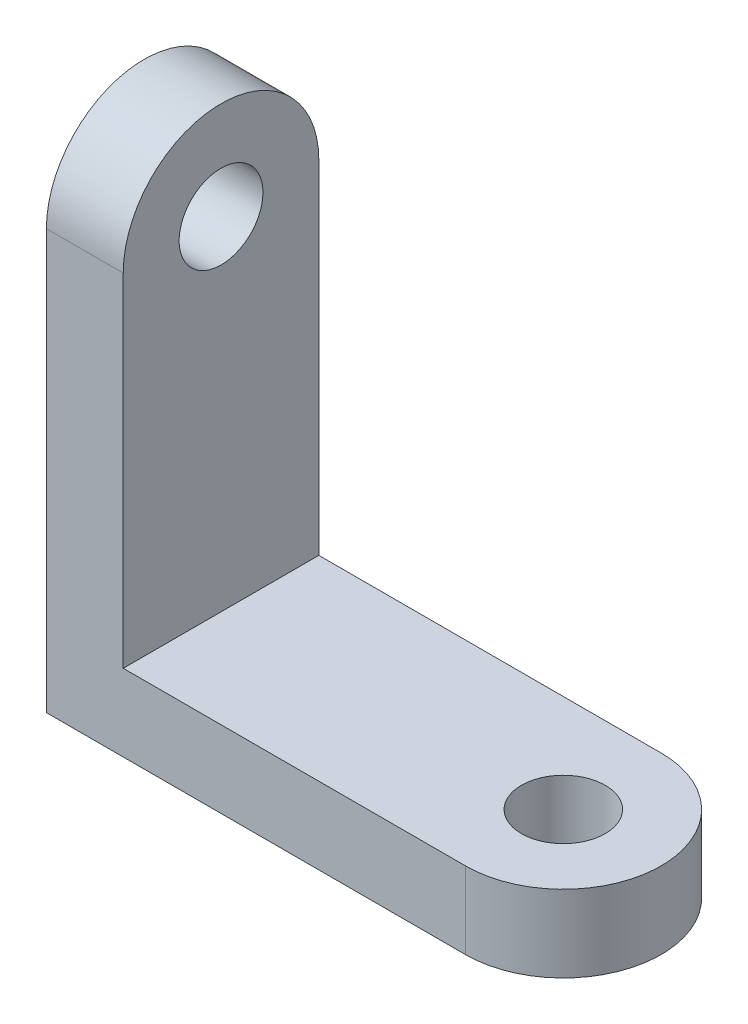
ISO-10303-21;
HEADER;
FILE_DESCRIPTION(('STEP AP214'),'2;1');
FILE_NAME('part.step','',(''),(''),'','','');
FILE_SCHEMA(('AUTOMOTIVE_DESIGN { 1 0 10303 214 1 1 1 1 }'));
ENDSEC;
DATA;
#1=APPLICATION_CONTEXT('core data for automotive mechanical design processes');
#2=APPLICATION_PROTOCOL_DEFINITION('international standard','automotive_design',2000,#1);
#3=PRODUCT_CONTEXT('',#1,'mechanical');
#4=PRODUCT('Part','Part','',(#3));
#5=PRODUCT_RELATED_PRODUCT_CATEGORY('part','',(#4));
#6=PRODUCT_DEFINITION_FORMATION('','',#4);
#7=PRODUCT_DEFINITION_CONTEXT('part definition',#1,'design');
#8=PRODUCT_DEFINITION('design','',#6,#7);
#9=PRODUCT_DEFINITION_SHAPE('','',#8);
#10=(LENGTH_UNIT() NAMED_UNIT(*) SI_UNIT(.MILLI.,.METRE.));
#11=(NAMED_UNIT(*) PLANE_ANGLE_UNIT() SI_UNIT($,.RADIAN.));
#12=(NAMED_UNIT(*) SI_UNIT($,.STERADIAN.) SOLID_ANGLE_UNIT());
#13=UNCERTAINTY_MEASURE_WITH_UNIT(LENGTH_MEASURE(1.E-05),#10,'distance_accuracy_value','');
#14=(GEOMETRIC_REPRESENTATION_CONTEXT(3) GLOBAL_UNCERTAINTY_ASSIGNED_CONTEXT((#13)) GLOBAL_UNIT_ASSIGNED_CONTEXT((#10,
#11,#12)) REPRESENTATION_CONTEXT('',''));
#15=CARTESIAN_POINT('',(0.,0.,0.));
#16=DIRECTION('',(0.,0.,1.));
#17=DIRECTION('',(1.,0.,0.));
#18=AXIS2_PLACEMENT_3D('',#15,#16,#17);
#19=CARTESIAN_POINT('',(-7.5,2.75,-3.5));
#20=DIRECTION('',(1.,0.,0.));
#21=DIRECTION('',(0.,0.,-1.));
#22=AXIS2_PLACEMENT_3D('',#19,#20,#21);
#23=PLANE('',#22);
#24=CARTESIAN_POINT('',(-7.5,15.,0.));
#25=DIRECTION('',(1.,0.,0.));
#26=DIRECTION('',(0.,0.,-1.));
#27=AXIS2_PLACEMENT_3D('',#24,#25,#26);
#28=CIRCLE('',#27,1.5);
#29=CARTESIAN_POINT('',(-7.5,15.,-1.5));
#30=VERTEX_POINT('',#29);
#31=EDGE_CURVE('E114',#30,#30,#28,.T.);
#32=ORIENTED_EDGE('',*,*,#31,.T.);
#33=EDGE_LOOP('',(#32));
#34=FACE_BOUND('',#33,.T.);
#35=DIRECTION('',(0.,0.,1.));
#36=VECTOR('',#35,1.);
#37=CARTESIAN_POINT('',(-7.5,0.,-3.5));
#38=LINE('',#37,#36);
#39=CARTESIAN_POINT('',(-7.5,0.,-3.5));
#40=VERTEX_POINT('',#39);
#41=CARTESIAN_POINT('',(-7.5,0.,3.5));
#42=VERTEX_POINT('',#41);
#43=EDGE_CURVE('E121',#40,#42,#38,.T.);
#44=ORIENTED_EDGE('',*,*,#43,.T.);
#45=DIRECTION('',(0.,-1.,0.));
#46=VECTOR('',#45,1.);
#47=CARTESIAN_POINT('',(-7.5,2.75,3.5));
#48=LINE('',#47,#46);
#49=CARTESIAN_POINT('',(-7.5,15.,3.5));
#50=VERTEX_POINT('',#49);
#51=EDGE_CURVE('E11',#50,#42,#48,.T.);
#52=ORIENTED_EDGE('',*,*,#51,.F.);
#53=CARTESIAN_POINT('',(-7.5,15.,0.));
#54=DIRECTION('',(-1.,0.,0.));
#55=DIRECTION('',(0.,0.,-1.));
#56=AXIS2_PLACEMENT_3D('',#53,#54,#55);
#57=CIRCLE('',#56,3.5);
#58=CARTESIAN_POINT('',(-7.5,15.,-3.5));
#59=VERTEX_POINT('',#58);
#60=EDGE_CURVE('E104',#50,#59,#57,.T.);
#61=ORIENTED_EDGE('',*,*,#60,.T.);
#62=DIRECTION('',(0.,-1.,0.));
#63=VECTOR('',#62,1.);
#64=CARTESIAN_POINT('',(-7.5,2.75,-3.5));
#65=LINE('',#64,#63);
#66=EDGE_CURVE('E129',#59,#40,#65,.T.);
#67=ORIENTED_EDGE('',*,*,#66,.T.);
#68=EDGE_LOOP('',(#44,#52,#61,#67));
#69=FACE_BOUND('',#68,.T.);
#70=ADVANCED_FACE('F37',(#34,#69),#23,.F.);
#71=CARTESIAN_POINT('',(-7.5,2.75,3.5));
#72=DIRECTION('',(0.,0.,-1.));
#73=DIRECTION('',(-1.,0.,0.));
#74=AXIS2_PLACEMENT_3D('',#71,#72,#73);
#75=PLANE('',#74);
#76=DIRECTION('',(1.,0.,0.));
#77=VECTOR('',#76,1.);
#78=CARTESIAN_POINT('',(-7.5,2.75,3.5));
#79=LINE('',#78,#77);
#80=CARTESIAN_POINT('',(-4.75,2.75,3.5));
#81=VERTEX_POINT('',#80);
#82=CARTESIAN_POINT('',(7.5,2.75,3.5));
#83=VERTEX_POINT('',#82);
#84=EDGE_CURVE('E93',#81,#83,#79,.T.);
#85=ORIENTED_EDGE('',*,*,#84,.F.);
#86=DIRECTION('',(0.,1.,0.));
#87=VECTOR('',#86,1.);
#88=CARTESIAN_POINT('',(-4.75,0.,3.5));
#89=LINE('',#88,#87);
#90=CARTESIAN_POINT('',(-4.75,15.,3.5));
#91=VERTEX_POINT('',#90);
#92=EDGE_CURVE('E87',#81,#91,#89,.T.);
#93=ORIENTED_EDGE('',*,*,#92,.T.);
#94=DIRECTION('',(-1.,0.,0.));
#95=VECTOR('',#94,1.);
#96=CARTESIAN_POINT('',(-4.75,15.,3.5));
#97=LINE('',#96,#95);
#98=EDGE_CURVE('E90',#91,#50,#97,.T.);
#99=ORIENTED_EDGE('',*,*,#98,.T.);
#100=ORIENTED_EDGE('',*,*,#51,.T.);
#101=DIRECTION('',(1.,0.,0.));
#102=VECTOR('',#101,1.);
#103=CARTESIAN_POINT('',(-7.5,0.,3.5));
#104=LINE('',#103,#102);
#105=CARTESIAN_POINT('',(7.5,0.,3.5));
#106=VERTEX_POINT('',#105);
#107=EDGE_CURVE('E132',#42,#106,#104,.T.);
#108=ORIENTED_EDGE('',*,*,#107,.T.);
#109=DIRECTION('',(0.,-1.,0.));
#110=VECTOR('',#109,1.);
#111=CARTESIAN_POINT('',(7.5,2.75,3.5));
#112=LINE('',#111,#110);
#113=EDGE_CURVE('E44',#83,#106,#112,.T.);
#114=ORIENTED_EDGE('',*,*,#113,.F.);
#115=EDGE_LOOP('',(#85,#93,#99,#100,#108,#114));
#116=FACE_BOUND('',#115,.T.);
#117=ADVANCED_FACE('F89',(#116),#75,.F.);
#118=CARTESIAN_POINT('',(7.5,2.75,0.));
#119=DIRECTION('',(0.,-1.,0.));
#120=DIRECTION('',(0.,0.,-1.));
#121=AXIS2_PLACEMENT_3D('',#118,#119,#120);
#122=CYLINDRICAL_SURFACE('',#121,3.5);
#123=CARTESIAN_POINT('',(7.5,0.,0.));
#124=DIRECTION('',(0.,1.,0.));
#125=DIRECTION('',(0.,0.,-1.));
#126=AXIS2_PLACEMENT_3D('',#123,#124,#125);
#127=CIRCLE('',#126,3.5);
#128=CARTESIAN_POINT('',(7.5,0.,-3.5));
#129=VERTEX_POINT('',#128);
#130=EDGE_CURVE('E134',#106,#129,#127,.T.);
#131=ORIENTED_EDGE('',*,*,#130,.T.);
#132=DIRECTION('',(0.,-1.,0.));
#133=VECTOR('',#132,1.);
#134=CARTESIAN_POINT('',(7.5,2.75,-3.5));
#135=LINE('',#134,#133);
#136=CARTESIAN_POINT('',(7.5,2.75,-3.5));
#137=VERTEX_POINT('',#136);
#138=EDGE_CURVE('E139',#137,#129,#135,.T.);
#139=ORIENTED_EDGE('',*,*,#138,.F.);
#140=CARTESIAN_POINT('',(7.5,2.75,0.));
#141=DIRECTION('',(0.,1.,0.));
#142=DIRECTION('',(0.,0.,-1.));
#143=AXIS2_PLACEMENT_3D('',#140,#141,#142);
#144=CIRCLE('',#143,3.5);
#145=EDGE_CURVE('E125',#83,#137,#144,.T.);
#146=ORIENTED_EDGE('',*,*,#145,.F.);
#147=ORIENTED_EDGE('',*,*,#113,.T.);
#148=EDGE_LOOP('',(#131,#139,#146,#147));
#149=FACE_BOUND('',#148,.T.);
#150=ADVANCED_FACE('F145',(#149),#122,.T.);
#151=CARTESIAN_POINT('',(-7.5,2.75,-3.5));
#152=DIRECTION('',(0.,0.,1.));
#153=DIRECTION('',(1.,0.,0.));
#154=AXIS2_PLACEMENT_3D('',#151,#152,#153);
#155=PLANE('',#154);
#156=DIRECTION('',(-1.,0.,0.));
#157=VECTOR('',#156,1.);
#158=CARTESIAN_POINT('',(-7.5,0.,-3.5));
#159=LINE('',#158,#157);
#160=EDGE_CURVE('E126',#129,#40,#159,.T.);
#161=ORIENTED_EDGE('',*,*,#160,.T.);
#162=ORIENTED_EDGE('',*,*,#66,.F.);
#163=DIRECTION('',(-1.,0.,0.));
#164=VECTOR('',#163,1.);
#165=CARTESIAN_POINT('',(-4.75,15.,-3.5));
#166=LINE('',#165,#164);
#167=CARTESIAN_POINT('',(-4.75,15.,-3.5));
#168=VERTEX_POINT('',#167);
#169=EDGE_CURVE('E105',#168,#59,#166,.T.);
#170=ORIENTED_EDGE('',*,*,#169,.F.);
#171=DIRECTION('',(0.,-1.,0.));
#172=VECTOR('',#171,1.);
#173=CARTESIAN_POINT('',(-4.75,0.,-3.5));
#174=LINE('',#173,#172);
#175=CARTESIAN_POINT('',(-4.75,2.75,-3.5));
#176=VERTEX_POINT('',#175);
#177=EDGE_CURVE('E97',#168,#176,#174,.T.);
#178=ORIENTED_EDGE('',*,*,#177,.T.);
#179=DIRECTION('',(-1.,0.,0.));
#180=VECTOR('',#179,1.);
#181=CARTESIAN_POINT('',(-7.5,2.75,-3.5));
#182=LINE('',#181,#180);
#183=EDGE_CURVE('E51',#137,#176,#182,.T.);
#184=ORIENTED_EDGE('',*,*,#183,.F.);
#185=ORIENTED_EDGE('',*,*,#138,.T.);
#186=EDGE_LOOP('',(#161,#162,#170,#178,#184,#185));
#187=FACE_BOUND('',#186,.T.);
#188=ADVANCED_FACE('F153',(#187),#155,.F.);
#189=CARTESIAN_POINT('',(7.5,2.75,0.));
#190=DIRECTION('',(0.,-1.,0.));
#191=DIRECTION('',(0.,0.,-1.));
#192=AXIS2_PLACEMENT_3D('',#189,#190,#191);
#193=PLANE('',#192);
#194=CARTESIAN_POINT('',(7.5,2.75,0.));
#195=DIRECTION('',(0.,1.,0.));
#196=DIRECTION('',(0.,0.,1.));
#197=AXIS2_PLACEMENT_3D('',#194,#195,#196);
#198=CIRCLE('',#197,1.5);
#199=CARTESIAN_POINT('',(7.5,2.75,1.5));
#200=VERTEX_POINT('',#199);
#201=EDGE_CURVE('E117',#200,#200,#198,.T.);
#202=ORIENTED_EDGE('',*,*,#201,.F.);
#203=EDGE_LOOP('',(#202));
#204=FACE_BOUND('',#203,.T.);
#205=ORIENTED_EDGE('',*,*,#183,.T.);
#206=DIRECTION('',(0.,0.,1.));
#207=VECTOR('',#206,1.);
#208=CARTESIAN_POINT('',(-4.75,2.75,0.));
#209=LINE('',#208,#207);
#210=EDGE_CURVE('E55',#176,#81,#209,.T.);
#211=ORIENTED_EDGE('',*,*,#210,.T.);
#212=ORIENTED_EDGE('',*,*,#84,.T.);
#213=ORIENTED_EDGE('',*,*,#145,.T.);
#214=EDGE_LOOP('',(#205,#211,#212,#213));
#215=FACE_BOUND('',#214,.T.);
#216=ADVANCED_FACE('F183',(#204,#215),#193,.F.);
#217=CARTESIAN_POINT('',(7.5,0.,0.));
#218=DIRECTION('',(0.,-1.,0.));
#219=DIRECTION('',(0.,0.,-1.));
#220=AXIS2_PLACEMENT_3D('',#217,#218,#219);
#221=PLANE('',#220);
#222=ORIENTED_EDGE('',*,*,#130,.F.);
#223=ORIENTED_EDGE('',*,*,#107,.F.);
#224=ORIENTED_EDGE('',*,*,#43,.F.);
#225=ORIENTED_EDGE('',*,*,#160,.F.);
#226=EDGE_LOOP('',(#222,#223,#224,#225));
#227=FACE_BOUND('',#226,.T.);
#228=CARTESIAN_POINT('',(7.5,0.,0.));
#229=DIRECTION('',(0.,1.,0.));
#230=DIRECTION('',(0.,0.,1.));
#231=AXIS2_PLACEMENT_3D('',#228,#229,#230);
#232=CIRCLE('',#231,1.5);
#233=CARTESIAN_POINT('',(7.5,0.,1.5));
#234=VERTEX_POINT('',#233);
#235=EDGE_CURVE('E118',#234,#234,#232,.T.);
#236=ORIENTED_EDGE('',*,*,#235,.T.);
#237=EDGE_LOOP('',(#236));
#238=FACE_BOUND('',#237,.T.);
#239=ADVANCED_FACE('F149',(#227,#238),#221,.T.);
#240=CARTESIAN_POINT('',(7.5,0.,0.));
#241=DIRECTION('',(0.,1.,0.));
#242=DIRECTION('',(0.,0.,1.));
#243=AXIS2_PLACEMENT_3D('',#240,#241,#242);
#244=CYLINDRICAL_SURFACE('',#243,1.5);
#245=ORIENTED_EDGE('',*,*,#235,.F.);
#246=EDGE_LOOP('',(#245));
#247=FACE_BOUND('',#246,.T.);
#248=ORIENTED_EDGE('',*,*,#201,.T.);
#249=EDGE_LOOP('',(#248));
#250=FACE_BOUND('',#249,.T.);
#251=ADVANCED_FACE('F172',(#247,#250),#244,.F.);
#252=CARTESIAN_POINT('',(-4.75,15.,0.));
#253=DIRECTION('',(1.,0.,0.));
#254=DIRECTION('',(0.,0.,-1.));
#255=AXIS2_PLACEMENT_3D('',#252,#253,#254);
#256=PLANE('',#255);
#257=CARTESIAN_POINT('',(-4.75,15.,0.));
#258=DIRECTION('',(1.,0.,0.));
#259=DIRECTION('',(0.,0.,-1.));
#260=AXIS2_PLACEMENT_3D('',#257,#258,#259);
#261=CIRCLE('',#260,1.5);
#262=CARTESIAN_POINT('',(-4.75,15.,-1.5));
#263=VERTEX_POINT('',#262);
#264=EDGE_CURVE('E163',#263,#263,#261,.T.);
#265=ORIENTED_EDGE('',*,*,#264,.F.);
#266=EDGE_LOOP('',(#265));
#267=FACE_BOUND('',#266,.T.);
#268=ORIENTED_EDGE('',*,*,#210,.F.);
#269=ORIENTED_EDGE('',*,*,#177,.F.);
#270=CARTESIAN_POINT('',(-4.75,15.,0.));
#271=DIRECTION('',(-1.,0.,0.));
#272=DIRECTION('',(0.,0.,-1.));
#273=AXIS2_PLACEMENT_3D('',#270,#271,#272);
#274=CIRCLE('',#273,3.5);
#275=EDGE_CURVE('E96',#91,#168,#274,.T.);
#276=ORIENTED_EDGE('',*,*,#275,.F.);
#277=ORIENTED_EDGE('',*,*,#92,.F.);
#278=EDGE_LOOP('',(#268,#269,#276,#277));
#279=FACE_BOUND('',#278,.T.);
#280=ADVANCED_FACE('F108',(#267,#279),#256,.T.);
#281=CARTESIAN_POINT('',(-4.75,15.,0.));
#282=DIRECTION('',(-1.,0.,0.));
#283=DIRECTION('',(0.,0.,1.));
#284=AXIS2_PLACEMENT_3D('',#281,#282,#283);
#285=CYLINDRICAL_SURFACE('',#284,3.5);
#286=ORIENTED_EDGE('',*,*,#60,.F.);
#287=ORIENTED_EDGE('',*,*,#98,.F.);
#288=ORIENTED_EDGE('',*,*,#275,.T.);
#289=ORIENTED_EDGE('',*,*,#169,.T.);
#290=EDGE_LOOP('',(#286,#287,#288,#289));
#291=FACE_BOUND('',#290,.T.);
#292=ADVANCED_FACE('F101',(#291),#285,.T.);
#293=CARTESIAN_POINT('',(-7.5,15.,0.));
#294=DIRECTION('',(1.,0.,0.));
#295=DIRECTION('',(0.,0.,-1.));
#296=AXIS2_PLACEMENT_3D('',#293,#294,#295);
#297=CYLINDRICAL_SURFACE('',#296,1.5);
#298=ORIENTED_EDGE('',*,*,#31,.F.);
#299=EDGE_LOOP('',(#298));
#300=FACE_BOUND('',#299,.T.);
#301=ORIENTED_EDGE('',*,*,#264,.T.);
#302=EDGE_LOOP('',(#301));
#303=FACE_BOUND('',#302,.T.);
#304=ADVANCED_FACE('F169',(#300,#303),#297,.F.);
#305=CLOSED_SHELL('',(#70,#117,#150,#188,#216,#239,#251,#280,#292,#304));
#306=MANIFOLD_SOLID_BREP('B2',#305);
#307=ADVANCED_BREP_SHAPE_REPRESENTATION('',(#18,#306),#14);
#308=SHAPE_DEFINITION_REPRESENTATION(#9,#307);
ENDSEC;
END-ISO-10303-21;
